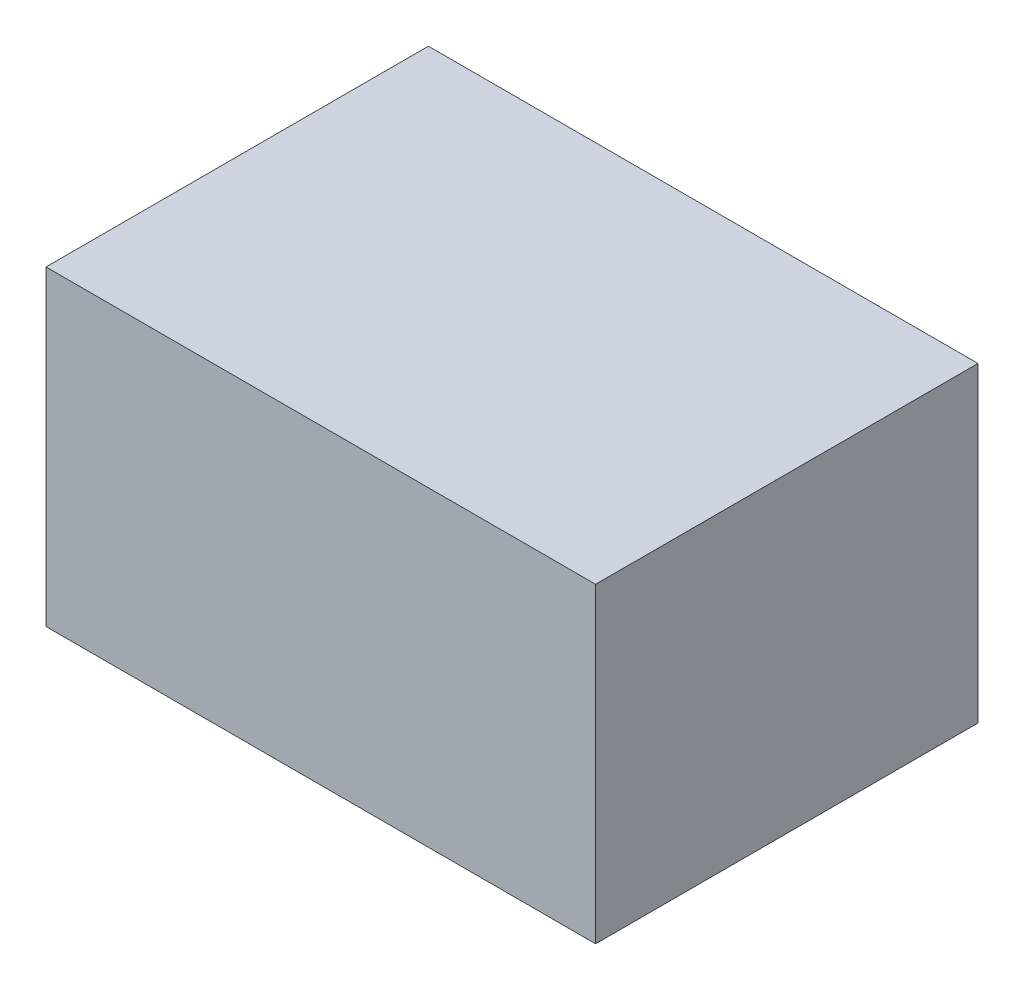
ISO-10303-21;
HEADER;
FILE_DESCRIPTION(('STEP AP214'),'2;1');
FILE_NAME('part.step','',(''),(''),'','','');
FILE_SCHEMA(('AUTOMOTIVE_DESIGN { 1 0 10303 214 1 1 1 1 }'));
ENDSEC;
DATA;
#1=APPLICATION_CONTEXT('core data for automotive mechanical design processes');
#2=APPLICATION_PROTOCOL_DEFINITION('international standard','automotive_design',2000,#1);
#3=PRODUCT_CONTEXT('',#1,'mechanical');
#4=PRODUCT('Part','Part','',(#3));
#5=PRODUCT_RELATED_PRODUCT_CATEGORY('part','',(#4));
#6=PRODUCT_DEFINITION_FORMATION('','',#4);
#7=PRODUCT_DEFINITION_CONTEXT('part definition',#1,'design');
#8=PRODUCT_DEFINITION('design','',#6,#7);
#9=PRODUCT_DEFINITION_SHAPE('','',#8);
#10=(LENGTH_UNIT() NAMED_UNIT(*) SI_UNIT(.MILLI.,.METRE.));
#11=(NAMED_UNIT(*) PLANE_ANGLE_UNIT() SI_UNIT($,.RADIAN.));
#12=(NAMED_UNIT(*) SI_UNIT($,.STERADIAN.) SOLID_ANGLE_UNIT());
#13=UNCERTAINTY_MEASURE_WITH_UNIT(LENGTH_MEASURE(1.E-05),#10,'distance_accuracy_value','');
#14=(GEOMETRIC_REPRESENTATION_CONTEXT(3) GLOBAL_UNCERTAINTY_ASSIGNED_CONTEXT((#13)) GLOBAL_UNIT_ASSIGNED_CONTEXT((#10,
#11,#12)) REPRESENTATION_CONTEXT('',''));
#15=CARTESIAN_POINT('',(0.,0.,0.));
#16=DIRECTION('',(0.,0.,1.));
#17=DIRECTION('',(1.,0.,0.));
#18=AXIS2_PLACEMENT_3D('',#15,#16,#17);
#19=CARTESIAN_POINT('',(0.,0.,350.));
#20=DIRECTION('',(1.,0.,0.));
#21=DIRECTION('',(0.,0.,-1.));
#22=AXIS2_PLACEMENT_3D('',#19,#20,#21);
#23=PLANE('',#22);
#24=DIRECTION('',(0.,-1.,0.));
#25=VECTOR('',#24,1.);
#26=CARTESIAN_POINT('',(0.,0.,0.));
#27=LINE('',#26,#25);
#28=CARTESIAN_POINT('',(0.,285.,0.));
#29=VERTEX_POINT('',#28);
#30=CARTESIAN_POINT('',(0.,0.,0.));
#31=VERTEX_POINT('',#30);
#32=EDGE_CURVE('E100',#29,#31,#27,.T.);
#33=ORIENTED_EDGE('',*,*,#32,.T.);
#34=DIRECTION('',(0.,0.,-1.));
#35=VECTOR('',#34,1.);
#36=CARTESIAN_POINT('',(0.,0.,350.));
#37=LINE('',#36,#35);
#38=CARTESIAN_POINT('',(0.,0.,350.));
#39=VERTEX_POINT('',#38);
#40=EDGE_CURVE('E91',#39,#31,#37,.T.);
#41=ORIENTED_EDGE('',*,*,#40,.F.);
#42=DIRECTION('',(0.,-1.,0.));
#43=VECTOR('',#42,1.);
#44=CARTESIAN_POINT('',(0.,0.,350.));
#45=LINE('',#44,#43);
#46=CARTESIAN_POINT('',(0.,285.,350.));
#47=VERTEX_POINT('',#46);
#48=EDGE_CURVE('E85',#47,#39,#45,.T.);
#49=ORIENTED_EDGE('',*,*,#48,.F.);
#50=DIRECTION('',(0.,0.,-1.));
#51=VECTOR('',#50,1.);
#52=CARTESIAN_POINT('',(0.,285.,350.));
#53=LINE('',#52,#51);
#54=EDGE_CURVE('E96',#47,#29,#53,.T.);
#55=ORIENTED_EDGE('',*,*,#54,.T.);
#56=EDGE_LOOP('',(#33,#41,#49,#55));
#57=FACE_BOUND('',#56,.T.);
#58=ADVANCED_FACE('F33',(#57),#23,.F.);
#59=CARTESIAN_POINT('',(0.,0.,350.));
#60=DIRECTION('',(0.,1.,0.));
#61=DIRECTION('',(0.,0.,1.));
#62=AXIS2_PLACEMENT_3D('',#59,#60,#61);
#63=PLANE('',#62);
#64=CARTESIAN_POINT('',(84.3995659148759,0.,75.4712301699595));
#65=DIRECTION('',(0.,1.,0.));
#66=DIRECTION('',(0.,0.,1.));
#67=AXIS2_PLACEMENT_3D('',#64,#65,#66);
#68=CIRCLE('',#67,19.);
#69=CARTESIAN_POINT('',(84.3995659148759,0.,94.4712301699595));
#70=VERTEX_POINT('',#69);
#71=EDGE_CURVE('E11',#70,#70,#68,.F.);
#72=ORIENTED_EDGE('',*,*,#71,.F.);
#73=EDGE_LOOP('',(#72));
#74=FACE_BOUND('',#73,.T.);
#75=CARTESIAN_POINT('',(403.747062166446,0.,75.4712301699595));
#76=DIRECTION('',(0.,1.,0.));
#77=DIRECTION('',(0.,0.,1.));
#78=AXIS2_PLACEMENT_3D('',#75,#76,#77);
#79=CIRCLE('',#78,19.);
#80=CARTESIAN_POINT('',(403.747062166446,0.,94.4712301699596));
#81=VERTEX_POINT('',#80);
#82=EDGE_CURVE('E41',#81,#81,#79,.F.);
#83=ORIENTED_EDGE('',*,*,#82,.F.);
#84=EDGE_LOOP('',(#83));
#85=FACE_BOUND('',#84,.T.);
#86=CARTESIAN_POINT('',(403.747062166446,0.,294.555551983669));
#87=DIRECTION('',(0.,1.,0.));
#88=DIRECTION('',(0.,0.,1.));
#89=AXIS2_PLACEMENT_3D('',#86,#87,#88);
#90=CIRCLE('',#89,19.);
#91=CARTESIAN_POINT('',(403.747062166446,0.,313.555551983669));
#92=VERTEX_POINT('',#91);
#93=EDGE_CURVE('E113',#92,#92,#90,.F.);
#94=ORIENTED_EDGE('',*,*,#93,.F.);
#95=EDGE_LOOP('',(#94));
#96=FACE_BOUND('',#95,.T.);
#97=CARTESIAN_POINT('',(84.3995659148759,0.,294.555551983669));
#98=DIRECTION('',(0.,1.,0.));
#99=DIRECTION('',(0.,0.,1.));
#100=AXIS2_PLACEMENT_3D('',#97,#98,#99);
#101=CIRCLE('',#100,19.);
#102=CARTESIAN_POINT('',(84.3995659148759,0.,313.555551983669));
#103=VERTEX_POINT('',#102);
#104=EDGE_CURVE('E110',#103,#103,#101,.F.);
#105=ORIENTED_EDGE('',*,*,#104,.F.);
#106=EDGE_LOOP('',(#105));
#107=FACE_BOUND('',#106,.T.);
#108=DIRECTION('',(1.,0.,0.));
#109=VECTOR('',#108,1.);
#110=CARTESIAN_POINT('',(0.,0.,0.));
#111=LINE('',#110,#109);
#112=CARTESIAN_POINT('',(503.,0.,0.));
#113=VERTEX_POINT('',#112);
#114=EDGE_CURVE('E90',#31,#113,#111,.T.);
#115=ORIENTED_EDGE('',*,*,#114,.T.);
#116=DIRECTION('',(0.,0.,-1.));
#117=VECTOR('',#116,1.);
#118=CARTESIAN_POINT('',(503.,0.,350.));
#119=LINE('',#118,#117);
#120=CARTESIAN_POINT('',(503.,0.,350.));
#121=VERTEX_POINT('',#120);
#122=EDGE_CURVE('E88',#121,#113,#119,.T.);
#123=ORIENTED_EDGE('',*,*,#122,.F.);
#124=DIRECTION('',(1.,0.,0.));
#125=VECTOR('',#124,1.);
#126=CARTESIAN_POINT('',(0.,0.,350.));
#127=LINE('',#126,#125);
#128=EDGE_CURVE('E80',#39,#121,#127,.T.);
#129=ORIENTED_EDGE('',*,*,#128,.F.);
#130=ORIENTED_EDGE('',*,*,#40,.T.);
#131=EDGE_LOOP('',(#115,#123,#129,#130));
#132=FACE_BOUND('',#131,.T.);
#133=ADVANCED_FACE('F89',(#74,#85,#96,#107,#132),#63,.F.);
#134=CARTESIAN_POINT('',(503.,0.,350.));
#135=DIRECTION('',(-1.,0.,0.));
#136=DIRECTION('',(0.,0.,1.));
#137=AXIS2_PLACEMENT_3D('',#134,#135,#136);
#138=PLANE('',#137);
#139=DIRECTION('',(0.,1.,0.));
#140=VECTOR('',#139,1.);
#141=CARTESIAN_POINT('',(503.,0.,0.));
#142=LINE('',#141,#140);
#143=CARTESIAN_POINT('',(503.,285.,0.));
#144=VERTEX_POINT('',#143);
#145=EDGE_CURVE('E66',#113,#144,#142,.T.);
#146=ORIENTED_EDGE('',*,*,#145,.T.);
#147=DIRECTION('',(0.,0.,-1.));
#148=VECTOR('',#147,1.);
#149=CARTESIAN_POINT('',(503.,285.,350.));
#150=LINE('',#149,#148);
#151=CARTESIAN_POINT('',(503.,285.,350.));
#152=VERTEX_POINT('',#151);
#153=EDGE_CURVE('E92',#152,#144,#150,.T.);
#154=ORIENTED_EDGE('',*,*,#153,.F.);
#155=DIRECTION('',(0.,1.,0.));
#156=VECTOR('',#155,1.);
#157=CARTESIAN_POINT('',(503.,0.,350.));
#158=LINE('',#157,#156);
#159=EDGE_CURVE('E83',#121,#152,#158,.T.);
#160=ORIENTED_EDGE('',*,*,#159,.F.);
#161=ORIENTED_EDGE('',*,*,#122,.T.);
#162=EDGE_LOOP('',(#146,#154,#160,#161));
#163=FACE_BOUND('',#162,.T.);
#164=ADVANCED_FACE('F94',(#163),#138,.F.);
#165=CARTESIAN_POINT('',(0.,285.,350.));
#166=DIRECTION('',(0.,-1.,0.));
#167=DIRECTION('',(0.,0.,-1.));
#168=AXIS2_PLACEMENT_3D('',#165,#166,#167);
#169=PLANE('',#168);
#170=DIRECTION('',(-1.,0.,0.));
#171=VECTOR('',#170,1.);
#172=CARTESIAN_POINT('',(0.,285.,0.));
#173=LINE('',#172,#171);
#174=EDGE_CURVE('E72',#144,#29,#173,.T.);
#175=ORIENTED_EDGE('',*,*,#174,.T.);
#176=ORIENTED_EDGE('',*,*,#54,.F.);
#177=DIRECTION('',(-1.,0.,0.));
#178=VECTOR('',#177,1.);
#179=CARTESIAN_POINT('',(0.,285.,350.));
#180=LINE('',#179,#178);
#181=EDGE_CURVE('E49',#152,#47,#180,.T.);
#182=ORIENTED_EDGE('',*,*,#181,.F.);
#183=ORIENTED_EDGE('',*,*,#153,.T.);
#184=EDGE_LOOP('',(#175,#176,#182,#183));
#185=FACE_BOUND('',#184,.T.);
#186=ADVANCED_FACE('F149',(#185),#169,.F.);
#187=CARTESIAN_POINT('',(0.,0.,350.));
#188=DIRECTION('',(0.,0.,-1.));
#189=DIRECTION('',(-1.,0.,0.));
#190=AXIS2_PLACEMENT_3D('',#187,#188,#189);
#191=PLANE('',#190);
#192=ORIENTED_EDGE('',*,*,#48,.T.);
#193=ORIENTED_EDGE('',*,*,#128,.T.);
#194=ORIENTED_EDGE('',*,*,#159,.T.);
#195=ORIENTED_EDGE('',*,*,#181,.T.);
#196=EDGE_LOOP('',(#192,#193,#194,#195));
#197=FACE_BOUND('',#196,.T.);
#198=ADVANCED_FACE('F81',(#197),#191,.F.);
#199=CARTESIAN_POINT('',(0.,0.,0.));
#200=DIRECTION('',(0.,0.,-1.));
#201=DIRECTION('',(-1.,0.,0.));
#202=AXIS2_PLACEMENT_3D('',#199,#200,#201);
#203=PLANE('',#202);
#204=ORIENTED_EDGE('',*,*,#32,.F.);
#205=ORIENTED_EDGE('',*,*,#174,.F.);
#206=ORIENTED_EDGE('',*,*,#145,.F.);
#207=ORIENTED_EDGE('',*,*,#114,.F.);
#208=EDGE_LOOP('',(#204,#205,#206,#207));
#209=FACE_BOUND('',#208,.T.);
#210=ADVANCED_FACE('F130',(#209),#203,.T.);
#211=CARTESIAN_POINT('',(84.3995659148759,-25.,294.555551983669));
#212=DIRECTION('',(0.,1.,0.));
#213=DIRECTION('',(0.,0.,1.));
#214=AXIS2_PLACEMENT_3D('',#211,#212,#213);
#215=CYLINDRICAL_SURFACE('',#214,19.);
#216=CARTESIAN_POINT('',(84.3995659148759,-25.,294.555551983669));
#217=DIRECTION('',(0.,-1.,0.));
#218=DIRECTION('',(0.,0.,-1.));
#219=AXIS2_PLACEMENT_3D('',#216,#217,#218);
#220=CIRCLE('',#219,19.);
#221=CARTESIAN_POINT('',(84.3995659148759,-25.,275.555551983669));
#222=VERTEX_POINT('',#221);
#223=EDGE_CURVE('E103',#222,#222,#220,.T.);
#224=ORIENTED_EDGE('',*,*,#223,.F.);
#225=EDGE_LOOP('',(#224));
#226=FACE_BOUND('',#225,.T.);
#227=ORIENTED_EDGE('',*,*,#104,.T.);
#228=EDGE_LOOP('',(#227));
#229=FACE_BOUND('',#228,.T.);
#230=ADVANCED_FACE('F127',(#226,#229),#215,.T.);
#231=CARTESIAN_POINT('',(84.3995659148759,-25.,294.555551983669));
#232=DIRECTION('',(0.,-1.,0.));
#233=DIRECTION('',(0.,0.,-1.));
#234=AXIS2_PLACEMENT_3D('',#231,#232,#233);
#235=PLANE('',#234);
#236=ORIENTED_EDGE('',*,*,#223,.T.);
#237=EDGE_LOOP('',(#236));
#238=FACE_BOUND('',#237,.T.);
#239=ADVANCED_FACE('F129',(#238),#235,.T.);
#240=CARTESIAN_POINT('',(403.747062166446,-25.,294.555551983669));
#241=DIRECTION('',(0.,1.,0.));
#242=DIRECTION('',(0.,0.,1.));
#243=AXIS2_PLACEMENT_3D('',#240,#241,#242);
#244=CYLINDRICAL_SURFACE('',#243,19.);
#245=CARTESIAN_POINT('',(403.747062166446,-25.,294.555551983669));
#246=DIRECTION('',(0.,-1.,0.));
#247=DIRECTION('',(0.,0.,-1.));
#248=AXIS2_PLACEMENT_3D('',#245,#246,#247);
#249=CIRCLE('',#248,19.);
#250=CARTESIAN_POINT('',(403.747062166446,-25.,275.555551983669));
#251=VERTEX_POINT('',#250);
#252=EDGE_CURVE('E246',#251,#251,#249,.T.);
#253=ORIENTED_EDGE('',*,*,#252,.F.);
#254=EDGE_LOOP('',(#253));
#255=FACE_BOUND('',#254,.T.);
#256=ORIENTED_EDGE('',*,*,#93,.T.);
#257=EDGE_LOOP('',(#256));
#258=FACE_BOUND('',#257,.T.);
#259=ADVANCED_FACE('F137',(#255,#258),#244,.T.);
#260=CARTESIAN_POINT('',(403.747062166446,-25.,294.555551983669));
#261=DIRECTION('',(0.,-1.,0.));
#262=DIRECTION('',(0.,0.,-1.));
#263=AXIS2_PLACEMENT_3D('',#260,#261,#262);
#264=PLANE('',#263);
#265=ORIENTED_EDGE('',*,*,#252,.T.);
#266=EDGE_LOOP('',(#265));
#267=FACE_BOUND('',#266,.T.);
#268=ADVANCED_FACE('F187',(#267),#264,.T.);
#269=CARTESIAN_POINT('',(403.747062166446,-25.,75.4712301699595));
#270=DIRECTION('',(0.,1.,0.));
#271=DIRECTION('',(0.,0.,1.));
#272=AXIS2_PLACEMENT_3D('',#269,#270,#271);
#273=CYLINDRICAL_SURFACE('',#272,19.);
#274=CARTESIAN_POINT('',(403.747062166446,-25.,75.4712301699595));
#275=DIRECTION('',(0.,-1.,0.));
#276=DIRECTION('',(0.,0.,-1.));
#277=AXIS2_PLACEMENT_3D('',#274,#275,#276);
#278=CIRCLE('',#277,19.);
#279=CARTESIAN_POINT('',(403.747062166446,-25.,56.4712301699595));
#280=VERTEX_POINT('',#279);
#281=EDGE_CURVE('E243',#280,#280,#278,.T.);
#282=ORIENTED_EDGE('',*,*,#281,.F.);
#283=EDGE_LOOP('',(#282));
#284=FACE_BOUND('',#283,.T.);
#285=ORIENTED_EDGE('',*,*,#82,.T.);
#286=EDGE_LOOP('',(#285));
#287=FACE_BOUND('',#286,.T.);
#288=ADVANCED_FACE('F118',(#284,#287),#273,.T.);
#289=CARTESIAN_POINT('',(403.747062166446,-25.,75.4712301699595));
#290=DIRECTION('',(0.,-1.,0.));
#291=DIRECTION('',(0.,0.,-1.));
#292=AXIS2_PLACEMENT_3D('',#289,#290,#291);
#293=PLANE('',#292);
#294=ORIENTED_EDGE('',*,*,#281,.T.);
#295=EDGE_LOOP('',(#294));
#296=FACE_BOUND('',#295,.T.);
#297=ADVANCED_FACE('F206',(#296),#293,.T.);
#298=CARTESIAN_POINT('',(84.3995659148759,-25.,75.4712301699595));
#299=DIRECTION('',(0.,1.,0.));
#300=DIRECTION('',(0.,0.,1.));
#301=AXIS2_PLACEMENT_3D('',#298,#299,#300);
#302=CYLINDRICAL_SURFACE('',#301,19.);
#303=CARTESIAN_POINT('',(84.3995659148759,-25.,75.4712301699595));
#304=DIRECTION('',(0.,-1.,0.));
#305=DIRECTION('',(0.,0.,-1.));
#306=AXIS2_PLACEMENT_3D('',#303,#304,#305);
#307=CIRCLE('',#306,19.);
#308=CARTESIAN_POINT('',(84.3995659148759,-25.,56.4712301699595));
#309=VERTEX_POINT('',#308);
#310=EDGE_CURVE('E242',#309,#309,#307,.T.);
#311=ORIENTED_EDGE('',*,*,#310,.F.);
#312=EDGE_LOOP('',(#311));
#313=FACE_BOUND('',#312,.T.);
#314=ORIENTED_EDGE('',*,*,#71,.T.);
#315=EDGE_LOOP('',(#314));
#316=FACE_BOUND('',#315,.T.);
#317=ADVANCED_FACE('F216',(#313,#316),#302,.T.);
#318=CARTESIAN_POINT('',(84.3995659148759,-25.,75.4712301699595));
#319=DIRECTION('',(0.,-1.,0.));
#320=DIRECTION('',(0.,0.,-1.));
#321=AXIS2_PLACEMENT_3D('',#318,#319,#320);
#322=PLANE('',#321);
#323=ORIENTED_EDGE('',*,*,#310,.T.);
#324=EDGE_LOOP('',(#323));
#325=FACE_BOUND('',#324,.T.);
#326=ADVANCED_FACE('F226',(#325),#322,.T.);
#327=CLOSED_SHELL('',(#58,#133,#164,#186,#198,#210,#230,#239,#259,#268,#288,#297,#317,#326));
#328=MANIFOLD_SOLID_BREP('B2',#327);
#329=ADVANCED_BREP_SHAPE_REPRESENTATION('',(#18,#328),#14);
#330=SHAPE_DEFINITION_REPRESENTATION(#9,#329);
ENDSEC;
END-ISO-10303-21;
